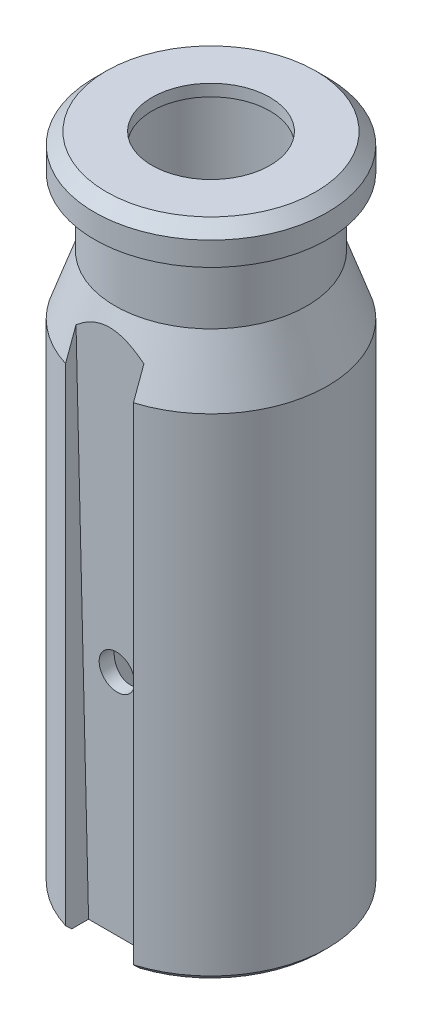
ISO-10303-21;
HEADER;
FILE_DESCRIPTION(('STEP AP214'),'2;1');
FILE_NAME('part.step','',(''),(''),'','','');
FILE_SCHEMA(('AUTOMOTIVE_DESIGN { 1 0 10303 214 1 1 1 1 }'));
ENDSEC;
DATA;
#1=APPLICATION_CONTEXT('core data for automotive mechanical design processes');
#2=APPLICATION_PROTOCOL_DEFINITION('international standard','automotive_design',2000,#1);
#3=PRODUCT_CONTEXT('',#1,'mechanical');
#4=PRODUCT('Part','Part','',(#3));
#5=PRODUCT_RELATED_PRODUCT_CATEGORY('part','',(#4));
#6=PRODUCT_DEFINITION_FORMATION('','',#4);
#7=PRODUCT_DEFINITION_CONTEXT('part definition',#1,'design');
#8=PRODUCT_DEFINITION('design','',#6,#7);
#9=PRODUCT_DEFINITION_SHAPE('','',#8);
#10=(LENGTH_UNIT() NAMED_UNIT(*) SI_UNIT(.MILLI.,.METRE.));
#11=(NAMED_UNIT(*) PLANE_ANGLE_UNIT() SI_UNIT($,.RADIAN.));
#12=(NAMED_UNIT(*) SI_UNIT($,.STERADIAN.) SOLID_ANGLE_UNIT());
#13=UNCERTAINTY_MEASURE_WITH_UNIT(LENGTH_MEASURE(1.E-05),#10,'distance_accuracy_value','');
#14=(GEOMETRIC_REPRESENTATION_CONTEXT(3) GLOBAL_UNCERTAINTY_ASSIGNED_CONTEXT((#13)) GLOBAL_UNIT_ASSIGNED_CONTEXT((#10,
#11,#12)) REPRESENTATION_CONTEXT('',''));
#15=CARTESIAN_POINT('',(0.,0.,0.));
#16=DIRECTION('',(0.,0.,1.));
#17=DIRECTION('',(1.,0.,0.));
#18=AXIS2_PLACEMENT_3D('',#15,#16,#17);
#19=CARTESIAN_POINT('',(1.3,0.,0.));
#20=DIRECTION('',(0.,-1.,0.));
#21=DIRECTION('',(0.,0.,-1.));
#22=AXIS2_PLACEMENT_3D('',#19,#20,#21);
#23=PLANE('',#22);
#24=CARTESIAN_POINT('',(0.,0.,0.));
#25=DIRECTION('',(0.,-1.,0.));
#26=DIRECTION('',(0.,0.,-1.));
#27=AXIS2_PLACEMENT_3D('',#24,#25,#26);
#28=CIRCLE('',#27,1.3);
#29=CARTESIAN_POINT('',(0.,0.,-1.3));
#30=VERTEX_POINT('',#29);
#31=EDGE_CURVE('E253',#30,#30,#28,.T.);
#32=ORIENTED_EDGE('',*,*,#31,.F.);
#33=EDGE_LOOP('',(#32));
#34=FACE_BOUND('',#33,.T.);
#35=CARTESIAN_POINT('',(0.,0.,0.));
#36=DIRECTION('',(0.,-1.,0.));
#37=DIRECTION('',(0.,0.,-1.));
#38=AXIS2_PLACEMENT_3D('',#35,#36,#37);
#39=CIRCLE('',#38,3.75);
#40=CARTESIAN_POINT('',(1.15,0.,-3.56931365951495));
#41=VERTEX_POINT('',#40);
#42=CARTESIAN_POINT('',(1.15,0.,3.56931365951495));
#43=VERTEX_POINT('',#42);
#44=EDGE_CURVE('E147',#41,#43,#39,.T.);
#45=ORIENTED_EDGE('',*,*,#44,.T.);
#46=DIRECTION('',(0.,0.,-1.));
#47=VECTOR('',#46,1.);
#48=CARTESIAN_POINT('',(1.15,0.,3.95));
#49=LINE('',#48,#47);
#50=CARTESIAN_POINT('',(1.15,0.,3.));
#51=VERTEX_POINT('',#50);
#52=EDGE_CURVE('E131',#43,#51,#49,.T.);
#53=ORIENTED_EDGE('',*,*,#52,.T.);
#54=DIRECTION('',(-1.,0.,0.));
#55=VECTOR('',#54,1.);
#56=CARTESIAN_POINT('',(1.15,0.,3.));
#57=LINE('',#56,#55);
#58=CARTESIAN_POINT('',(-1.15,0.,3.));
#59=VERTEX_POINT('',#58);
#60=EDGE_CURVE('E138',#51,#59,#57,.T.);
#61=ORIENTED_EDGE('',*,*,#60,.T.);
#62=DIRECTION('',(0.,0.,1.));
#63=VECTOR('',#62,1.);
#64=CARTESIAN_POINT('',(-1.15,0.,3.95));
#65=LINE('',#64,#63);
#66=CARTESIAN_POINT('',(-1.15,0.,3.56931365951495));
#67=VERTEX_POINT('',#66);
#68=EDGE_CURVE('E142',#59,#67,#65,.T.);
#69=ORIENTED_EDGE('',*,*,#68,.T.);
#70=CARTESIAN_POINT('',(-1.15,0.,-3.56931365951495));
#71=VERTEX_POINT('',#70);
#72=EDGE_CURVE('E157',#67,#71,#39,.T.);
#73=ORIENTED_EDGE('',*,*,#72,.T.);
#74=DIRECTION('',(0.,0.,-1.));
#75=VECTOR('',#74,1.);
#76=CARTESIAN_POINT('',(-1.15,0.,-3.95));
#77=LINE('',#76,#75);
#78=CARTESIAN_POINT('',(-1.15,0.,-3.));
#79=VERTEX_POINT('',#78);
#80=EDGE_CURVE('E171',#79,#71,#77,.T.);
#81=ORIENTED_EDGE('',*,*,#80,.F.);
#82=DIRECTION('',(-1.,0.,0.));
#83=VECTOR('',#82,1.);
#84=CARTESIAN_POINT('',(1.15,0.,-3.));
#85=LINE('',#84,#83);
#86=CARTESIAN_POINT('',(1.15,0.,-3.));
#87=VERTEX_POINT('',#86);
#88=EDGE_CURVE('E175',#87,#79,#85,.T.);
#89=ORIENTED_EDGE('',*,*,#88,.F.);
#90=DIRECTION('',(0.,0.,1.));
#91=VECTOR('',#90,1.);
#92=CARTESIAN_POINT('',(1.15,0.,-3.95));
#93=LINE('',#92,#91);
#94=EDGE_CURVE('E181',#41,#87,#93,.T.);
#95=ORIENTED_EDGE('',*,*,#94,.F.);
#96=EDGE_LOOP('',(#45,#53,#61,#69,#73,#81,#89,#95));
#97=FACE_BOUND('',#96,.T.);
#98=ADVANCED_FACE('F48',(#34,#97),#23,.T.);
#99=CARTESIAN_POINT('',(0.,0.,0.));
#100=DIRECTION('',(0.,1.,0.));
#101=DIRECTION('',(0.,0.,1.));
#102=AXIS2_PLACEMENT_3D('',#99,#100,#101);
#103=CONICAL_SURFACE('',#102,3.75,0.785398163397447);
#104=CARTESIAN_POINT('',(0.,0.2,0.));
#105=DIRECTION('',(0.,-1.,0.));
#106=DIRECTION('',(0.,0.,-1.));
#107=AXIS2_PLACEMENT_3D('',#104,#105,#106);
#108=CIRCLE('',#107,3.95);
#109=CARTESIAN_POINT('',(1.15,0.2,-3.77888872553824));
#110=VERTEX_POINT('',#109);
#111=CARTESIAN_POINT('',(1.15,0.2,3.77888872553824));
#112=VERTEX_POINT('',#111);
#113=EDGE_CURVE('E159',#110,#112,#108,.T.);
#114=ORIENTED_EDGE('',*,*,#113,.T.);
#115=CARTESIAN_POINT('',(1.15,0.200225,3.77912391310804));
#116=CARTESIAN_POINT('',(1.15,0.16675950570913,3.74414562733071));
#117=CARTESIAN_POINT('',(1.15,0.133316342073734,3.70914603116538));
#118=CARTESIAN_POINT('',(1.15,0.0664746754061209,3.63910421731704));
#119=CARTESIAN_POINT('',(1.15,0.0330761723748503,3.60406199963314));
#120=CARTESIAN_POINT('',(1.15,-0.000300000000000059,3.56899847156033));
#121=B_SPLINE_CURVE_WITH_KNOTS('',3,(#115,#116,#117,#118,#119,#120),.UNSPECIFIED.,.F.,.F.,(4,2,
4),(0.,0.14522655518576,0.290453113447055),.UNSPECIFIED.);
#122=EDGE_CURVE('E476',#112,#43,#121,.T.);
#123=ORIENTED_EDGE('',*,*,#122,.T.);
#124=ORIENTED_EDGE('',*,*,#44,.F.);
#125=CARTESIAN_POINT('',(1.15,-0.000200000000000068,-3.56910353450275));
#126=CARTESIAN_POINT('',(1.15,0.0331553961812222,-3.60414514228176));
#127=CARTESIAN_POINT('',(1.15,0.0665330944485576,-3.6391654669155));
#128=CARTESIAN_POINT('',(1.15,0.1333330944495,-3.70916354915272));
#129=CARTESIAN_POINT('',(1.15,0.166755396182165,-3.74414130675709));
#130=CARTESIAN_POINT('',(1.15,0.2002,-3.7790977812171));
#131=B_SPLINE_CURVE_WITH_KNOTS('',3,(#125,#126,#127,#128,#129,#130),.UNSPECIFIED.,.F.,.F.,(4,2,
4),(0.,0.145135953201489,0.290271903335335),.UNSPECIFIED.);
#132=EDGE_CURVE('E251',#41,#110,#131,.T.);
#133=ORIENTED_EDGE('',*,*,#132,.T.);
#134=EDGE_LOOP('',(#114,#123,#124,#133));
#135=FACE_BOUND('',#134,.T.);
#136=ADVANCED_FACE('F224',(#135),#103,.T.);
#137=ORIENTED_EDGE('',*,*,#72,.F.);
#138=CARTESIAN_POINT('',(-1.15,-0.000299999999999731,3.56899847156033));
#139=CARTESIAN_POINT('',(-1.15,0.0330761723748504,3.60406199963314));
#140=CARTESIAN_POINT('',(-1.15,0.0664746754061209,3.63910421731704));
#141=CARTESIAN_POINT('',(-1.15,0.133316342073733,3.70914603116538));
#142=CARTESIAN_POINT('',(-1.15,0.16675950570913,3.74414562733071));
#143=CARTESIAN_POINT('',(-1.15,0.200225,3.77912391310804));
#144=B_SPLINE_CURVE_WITH_KNOTS('',3,(#138,#139,#140,#141,#142,#143),.UNSPECIFIED.,.F.,.F.,(4,2,
4),(0.,0.145226558261294,0.290453113447055),.UNSPECIFIED.);
#145=CARTESIAN_POINT('',(-1.15,0.2,3.77888872553824));
#146=VERTEX_POINT('',#145);
#147=EDGE_CURVE('E149',#67,#146,#144,.T.);
#148=ORIENTED_EDGE('',*,*,#147,.T.);
#149=CARTESIAN_POINT('',(-1.15,0.2,-3.77888872553824));
#150=VERTEX_POINT('',#149);
#151=EDGE_CURVE('E289',#146,#150,#108,.T.);
#152=ORIENTED_EDGE('',*,*,#151,.T.);
#153=CARTESIAN_POINT('',(-1.15,0.2002,-3.7790977812171));
#154=CARTESIAN_POINT('',(-1.15,0.166755396182165,-3.74414130675709));
#155=CARTESIAN_POINT('',(-1.15,0.1333330944495,-3.70916354915272));
#156=CARTESIAN_POINT('',(-1.15,0.0665330944485576,-3.63916546691551));
#157=CARTESIAN_POINT('',(-1.15,0.0331553961812223,-3.60414514228176));
#158=CARTESIAN_POINT('',(-1.15,-0.000199999999999869,-3.56910353450275));
#159=B_SPLINE_CURVE_WITH_KNOTS('',3,(#153,#154,#155,#156,#157,#158),.UNSPECIFIED.,.F.,.F.,(4,2,
4),(0.,0.145135950133845,0.290271903335334),.UNSPECIFIED.);
#160=EDGE_CURVE('E485',#150,#71,#159,.T.);
#161=ORIENTED_EDGE('',*,*,#160,.T.);
#162=EDGE_LOOP('',(#137,#148,#152,#161));
#163=FACE_BOUND('',#162,.T.);
#164=ADVANCED_FACE('F227',(#163),#103,.T.);
#165=CARTESIAN_POINT('',(0.,0.,0.));
#166=DIRECTION('',(0.,-1.,0.));
#167=DIRECTION('',(0.,0.,-1.));
#168=AXIS2_PLACEMENT_3D('',#165,#166,#167);
#169=CYLINDRICAL_SURFACE('',#168,3.95);
#170=CARTESIAN_POINT('',(0.,16.7,0.));
#171=DIRECTION('',(0.,-1.,0.));
#172=DIRECTION('',(0.,0.,-1.));
#173=AXIS2_PLACEMENT_3D('',#170,#171,#172);
#174=CIRCLE('',#173,3.95);
#175=CARTESIAN_POINT('',(1.15,16.7,-3.77888872553824));
#176=VERTEX_POINT('',#175);
#177=CARTESIAN_POINT('',(1.15,16.7,3.77888872553824));
#178=VERTEX_POINT('',#177);
#179=EDGE_CURVE('E286',#176,#178,#174,.T.);
#180=ORIENTED_EDGE('',*,*,#179,.T.);
#181=DIRECTION('',(0.,-1.,0.));
#182=VECTOR('',#181,1.);
#183=CARTESIAN_POINT('',(1.15,0.,3.77888872553824));
#184=LINE('',#183,#182);
#185=EDGE_CURVE('E501',#178,#112,#184,.T.);
#186=ORIENTED_EDGE('',*,*,#185,.T.);
#187=ORIENTED_EDGE('',*,*,#113,.F.);
#188=DIRECTION('',(0.,-1.,0.));
#189=VECTOR('',#188,1.);
#190=CARTESIAN_POINT('',(1.15,0.,-3.77888872553824));
#191=LINE('',#190,#189);
#192=EDGE_CURVE('E483',#110,#176,#191,.F.);
#193=ORIENTED_EDGE('',*,*,#192,.T.);
#194=EDGE_LOOP('',(#180,#186,#187,#193));
#195=FACE_BOUND('',#194,.T.);
#196=ADVANCED_FACE('F229',(#195),#169,.T.);
#197=ORIENTED_EDGE('',*,*,#151,.F.);
#198=DIRECTION('',(0.,-1.,0.));
#199=VECTOR('',#198,1.);
#200=CARTESIAN_POINT('',(-1.15,0.,3.77888872553824));
#201=LINE('',#200,#199);
#202=CARTESIAN_POINT('',(-1.15,16.7,3.77888872553824));
#203=VERTEX_POINT('',#202);
#204=EDGE_CURVE('E148',#146,#203,#201,.F.);
#205=ORIENTED_EDGE('',*,*,#204,.T.);
#206=CARTESIAN_POINT('',(-1.15,16.7,-3.77888872553824));
#207=VERTEX_POINT('',#206);
#208=EDGE_CURVE('E72',#203,#207,#174,.T.);
#209=ORIENTED_EDGE('',*,*,#208,.T.);
#210=DIRECTION('',(0.,-1.,0.));
#211=VECTOR('',#210,1.);
#212=CARTESIAN_POINT('',(-1.15,0.,-3.77888872553824));
#213=LINE('',#212,#211);
#214=EDGE_CURVE('E185',#207,#150,#213,.T.);
#215=ORIENTED_EDGE('',*,*,#214,.T.);
#216=EDGE_LOOP('',(#197,#205,#209,#215));
#217=FACE_BOUND('',#216,.T.);
#218=ADVANCED_FACE('F353',(#217),#169,.T.);
#219=CARTESIAN_POINT('',(0.,16.7,0.));
#220=DIRECTION('',(0.,-1.,0.));
#221=DIRECTION('',(0.,0.,-1.));
#222=AXIS2_PLACEMENT_3D('',#219,#220,#221);
#223=CONICAL_SURFACE('',#222,3.95,0.336674819386727);
#224=CARTESIAN_POINT('',(0.,18.7,0.));
#225=DIRECTION('',(0.,-1.,0.));
#226=DIRECTION('',(0.,0.,-1.));
#227=AXIS2_PLACEMENT_3D('',#224,#225,#226);
#228=CIRCLE('',#227,3.25);
#229=CARTESIAN_POINT('',(0.,18.7,-3.25));
#230=VERTEX_POINT('',#229);
#231=EDGE_CURVE('E283',#230,#230,#228,.T.);
#232=ORIENTED_EDGE('',*,*,#231,.T.);
#233=EDGE_LOOP('',(#232));
#234=FACE_BOUND('',#233,.T.);
#235=CARTESIAN_POINT('',(-1.1503,17.6627331962136,3.42503903413348));
#236=CARTESIAN_POINT('',(-1.11340986937978,17.6942265538726,3.42579689568143));
#237=CARTESIAN_POINT('',(-1.07584878108211,17.7249329414148,3.42653581944581));
#238=CARTESIAN_POINT('',(-0.999194089284043,17.7844779764666,3.42796872135882));
#239=CARTESIAN_POINT('',(-0.960098448803349,17.813313996706,3.42866263628437));
#240=CARTESIAN_POINT('',(-0.838767381594023,17.8975653770501,3.43069007591832));
#241=CARTESIAN_POINT('',(-0.753966097119917,17.9494222485725,3.43193796854854));
#242=CARTESIAN_POINT('',(-0.576330428398146,18.0398971314686,3.43411517161288));
#243=CARTESIAN_POINT('',(-0.483428009821175,18.0783860796479,3.43504137624821));
#244=CARTESIAN_POINT('',(-0.292371766603162,18.1355722067019,3.4364175129955));
#245=CARTESIAN_POINT('',(-0.194277493685058,18.1544573983353,3.43687196947866));
#246=CARTESIAN_POINT('',(-0.0102472295720071,18.1681115244492,3.437200544706));
#247=CARTESIAN_POINT('',(0.0754639963956187,18.1658918347715,3.43714712971375));
#248=CARTESIAN_POINT('',(0.244991873251715,18.1448144305306,3.43663991945127));
#249=CARTESIAN_POINT('',(0.328801908076904,18.1259057137957,3.43618489685605));
#250=CARTESIAN_POINT('',(0.507408868400063,18.0692770282759,3.43482217447723));
#251=CARTESIAN_POINT('',(0.60125689990116,18.028659491094,3.43384474711189));
#252=CARTESIAN_POINT('',(0.78153405653423,17.9334249535095,3.43155300690264));
#253=CARTESIAN_POINT('',(0.867945385931423,17.8787755545299,3.43023791441382));
#254=CARTESIAN_POINT('',(0.985331128168245,17.7947107302308,3.42821496409646));
#255=CARTESIAN_POINT('',(1.01920945671224,17.7691972895163,3.42760100429317));
#256=CARTESIAN_POINT('',(1.08565647121131,17.7168954142107,3.42634240301577));
#257=CARTESIAN_POINT('',(1.11823151905257,17.6901150719987,3.42569795627804));
#258=CARTESIAN_POINT('',(1.1503,17.6627331962136,3.42503903413348));
#259=B_SPLINE_CURVE_WITH_KNOTS('',3,(#235,#236,#237,#238,#239,#240,#241,#242,#243,#244,#245,
#246,#247,#248,#249,#250,#251,#252,#253,#254,#255,#256,#257,#258),.UNSPECIFIED.,.F.,.F.,(4,2,2,
2,2,2,2,2,2,2,2,4),(0.,0.14550977082224,0.291219697585221,0.588520120205237,0.888615916346047,
1.18580623469195,1.44130702487727,1.69759134729063,2.0027028441205,2.30852525816984,
2.4357464331425,2.56224277385796),.UNSPECIFIED.);
#260=CARTESIAN_POINT('',(-1.15,17.6629893599923,3.42504519850249));
#261=VERTEX_POINT('',#260);
#262=CARTESIAN_POINT('',(1.15,17.6629893599923,3.42504519850249));
#263=VERTEX_POINT('',#262);
#264=EDGE_CURVE('E56',#261,#263,#259,.T.);
#265=ORIENTED_EDGE('',*,*,#264,.T.);
#266=CARTESIAN_POINT('',(1.15,18.7002,3.03966198859347));
#267=CARTESIAN_POINT('',(1.15,18.5337505302106,3.10194646119254));
#268=CARTESIAN_POINT('',(1.15,18.3672243723403,3.1640255817215));
#269=CARTESIAN_POINT('',(1.15,18.0340409723636,3.28782941284661));
#270=CARTESIAN_POINT('',(1.15,17.8673837306944,3.3495541246194));
#271=CARTESIAN_POINT('',(1.15,17.5339595001939,3.47270578961336));
#272=CARTESIAN_POINT('',(1.15,17.3671925114622,3.5341327431047));
#273=CARTESIAN_POINT('',(1.15,17.0335635195748,3.65672982321873));
#274=CARTESIAN_POINT('',(1.15,16.866701516106,3.71789994898949));
#275=CARTESIAN_POINT('',(1.15,16.6998,3.77896189513734));
#276=B_SPLINE_CURVE_WITH_KNOTS('',3,(#266,#267,#268,#269,#270,#271,#272,#273,#274,#275),
.UNSPECIFIED.,.F.,.F.,(4,2,2,2,4),(0.,0.533162891940487,1.06632401278206,1.59948464980143,
2.13264705396192),.UNSPECIFIED.);
#277=EDGE_CURVE('E12',#263,#178,#276,.T.);
#278=ORIENTED_EDGE('',*,*,#277,.T.);
#279=ORIENTED_EDGE('',*,*,#179,.F.);
#280=CARTESIAN_POINT('',(1.15,16.6998,-3.77896189513734));
#281=CARTESIAN_POINT('',(1.15,16.866701516106,-3.71789994898949));
#282=CARTESIAN_POINT('',(1.15,17.0335635195748,-3.65672982321873));
#283=CARTESIAN_POINT('',(1.15,17.3671925114622,-3.5341327431047));
#284=CARTESIAN_POINT('',(1.15,17.5339595001939,-3.47270578961337));
#285=CARTESIAN_POINT('',(1.15,17.8673837306944,-3.3495541246194));
#286=CARTESIAN_POINT('',(1.15,18.0340409723636,-3.28782941284661));
#287=CARTESIAN_POINT('',(1.15,18.3672243723403,-3.1640255817215));
#288=CARTESIAN_POINT('',(1.15,18.5337505302106,-3.10194646119254));
#289=CARTESIAN_POINT('',(1.15,18.7002,-3.03966198859348));
#290=B_SPLINE_CURVE_WITH_KNOTS('',3,(#280,#281,#282,#283,#284,#285,#286,#287,#288,#289),
.UNSPECIFIED.,.F.,.F.,(4,2,2,2,4),(0.,0.533162404160496,1.06632304117986,1.59948416202143,
2.13264705396192),.UNSPECIFIED.);
#291=CARTESIAN_POINT('',(1.15,17.6629893599923,-3.42504519850249));
#292=VERTEX_POINT('',#291);
#293=EDGE_CURVE('E195',#176,#292,#290,.T.);
#294=ORIENTED_EDGE('',*,*,#293,.T.);
#295=CARTESIAN_POINT('',(1.1503,17.6627331962136,-3.42503903413348));
#296=CARTESIAN_POINT('',(1.11340986937978,17.6942265538726,-3.42579689568143));
#297=CARTESIAN_POINT('',(1.07584878108211,17.7249329414148,-3.42653581944581));
#298=CARTESIAN_POINT('',(0.999194089284043,17.7844779764666,-3.42796872135882));
#299=CARTESIAN_POINT('',(0.960098448803349,17.813313996706,-3.42866263628437));
#300=CARTESIAN_POINT('',(0.838767381594022,17.8975653770501,-3.43069007591832));
#301=CARTESIAN_POINT('',(0.753966097119915,17.9494222485725,-3.43193796854854));
#302=CARTESIAN_POINT('',(0.576330428398144,18.0398971314686,-3.43411517161288));
#303=CARTESIAN_POINT('',(0.483428009821173,18.0783860796479,-3.43504137624821));
#304=CARTESIAN_POINT('',(0.292371766603159,18.1355722067019,-3.4364175129955));
#305=CARTESIAN_POINT('',(0.194277493685054,18.1544573983353,-3.43687196947866));
#306=CARTESIAN_POINT('',(0.0102472295720029,18.1681115244492,-3.437200544706));
#307=CARTESIAN_POINT('',(-0.0754639963956222,18.1658918347715,-3.43714712971375));
#308=CARTESIAN_POINT('',(-0.244991873251718,18.1448144305306,-3.43663991945127));
#309=CARTESIAN_POINT('',(-0.328801908076907,18.1259057137957,-3.43618489685605));
#310=CARTESIAN_POINT('',(-0.507408868400066,18.0692770282759,-3.43482217447723));
#311=CARTESIAN_POINT('',(-0.601256899901163,18.028659491094,-3.43384474711189));
#312=CARTESIAN_POINT('',(-0.781534056534232,17.9334249535095,-3.43155300690264));
#313=CARTESIAN_POINT('',(-0.867945385931425,17.8787755545299,-3.43023791441382));
#314=CARTESIAN_POINT('',(-0.985331128168246,17.7947107302308,-3.42821496409646));
#315=CARTESIAN_POINT('',(-1.01920945671224,17.7691972895163,-3.42760100429317));
#316=CARTESIAN_POINT('',(-1.08565647121131,17.7168954142107,-3.42634240301577));
#317=CARTESIAN_POINT('',(-1.11823151905257,17.6901150719987,-3.42569795627804));
#318=CARTESIAN_POINT('',(-1.1503,17.6627331962136,-3.42503903413348));
#319=B_SPLINE_CURVE_WITH_KNOTS('',3,(#295,#296,#297,#298,#299,#300,#301,#302,#303,#304,#305,
#306,#307,#308,#309,#310,#311,#312,#313,#314,#315,#316,#317,#318),.UNSPECIFIED.,.F.,.F.,(4,2,2,
2,2,2,2,2,2,2,2,4),(0.,0.145509770822242,0.291219697585223,0.58852012020524,0.888615916346052,
1.18580623469195,1.44130702487728,1.69759134729064,2.0027028441205,2.30852525816984,
2.43574643314251,2.56224277385796),.UNSPECIFIED.);
#320=CARTESIAN_POINT('',(-1.15,17.6629893599923,-3.42504519850249));
#321=VERTEX_POINT('',#320);
#322=EDGE_CURVE('E299',#292,#321,#319,.T.);
#323=ORIENTED_EDGE('',*,*,#322,.T.);
#324=CARTESIAN_POINT('',(-1.15,18.7002,-3.03966198859347));
#325=CARTESIAN_POINT('',(-1.15,18.5337505302106,-3.10194646119254));
#326=CARTESIAN_POINT('',(-1.15,18.3672243723403,-3.1640255817215));
#327=CARTESIAN_POINT('',(-1.15,18.0340409723636,-3.28782941284661));
#328=CARTESIAN_POINT('',(-1.15,17.8673837306944,-3.3495541246194));
#329=CARTESIAN_POINT('',(-1.15,17.5339595001939,-3.47270578961336));
#330=CARTESIAN_POINT('',(-1.15,17.3671925114622,-3.5341327431047));
#331=CARTESIAN_POINT('',(-1.15,17.0335635195748,-3.65672982321872));
#332=CARTESIAN_POINT('',(-1.15,16.866701516106,-3.71789994898949));
#333=CARTESIAN_POINT('',(-1.15,16.6998,-3.77896189513734));
#334=B_SPLINE_CURVE_WITH_KNOTS('',3,(#324,#325,#326,#327,#328,#329,#330,#331,#332,#333),
.UNSPECIFIED.,.F.,.F.,(4,2,2,2,4),(0.,0.533162891940483,1.06632401278206,1.59948464980142,
2.13264705396192),.UNSPECIFIED.);
#335=EDGE_CURVE('E292',#321,#207,#334,.T.);
#336=ORIENTED_EDGE('',*,*,#335,.T.);
#337=ORIENTED_EDGE('',*,*,#208,.F.);
#338=CARTESIAN_POINT('',(-1.15,16.6998,3.77896189513734));
#339=CARTESIAN_POINT('',(-1.15,16.866701516106,3.71789994898949));
#340=CARTESIAN_POINT('',(-1.15,17.0335635195748,3.65672982321873));
#341=CARTESIAN_POINT('',(-1.15,17.3671925114622,3.5341327431047));
#342=CARTESIAN_POINT('',(-1.15,17.5339595001939,3.47270578961337));
#343=CARTESIAN_POINT('',(-1.15,17.8673837306944,3.3495541246194));
#344=CARTESIAN_POINT('',(-1.15,18.0340409723636,3.28782941284661));
#345=CARTESIAN_POINT('',(-1.15,18.3672243723403,3.1640255817215));
#346=CARTESIAN_POINT('',(-1.15,18.5337505302106,3.10194646119255));
#347=CARTESIAN_POINT('',(-1.15,18.7002,3.03966198859348));
#348=B_SPLINE_CURVE_WITH_KNOTS('',3,(#338,#339,#340,#341,#342,#343,#344,#345,#346,#347),
.UNSPECIFIED.,.F.,.F.,(4,2,2,2,4),(0.,0.533162404160496,1.06632304117986,1.59948416202143,
2.13264705396192),.UNSPECIFIED.);
#349=EDGE_CURVE('E188',#203,#261,#348,.T.);
#350=ORIENTED_EDGE('',*,*,#349,.T.);
#351=EDGE_LOOP('',(#265,#278,#279,#294,#323,#336,#337,#350));
#352=FACE_BOUND('',#351,.T.);
#353=ADVANCED_FACE('F201',(#234,#352),#223,.T.);
#354=CARTESIAN_POINT('',(0.,0.,0.));
#355=DIRECTION('',(0.,-1.,0.));
#356=DIRECTION('',(0.,0.,-1.));
#357=AXIS2_PLACEMENT_3D('',#354,#355,#356);
#358=CYLINDRICAL_SURFACE('',#357,3.25);
#359=CARTESIAN_POINT('',(0.,21.,0.));
#360=DIRECTION('',(0.,-1.,0.));
#361=DIRECTION('',(0.,0.,-1.));
#362=AXIS2_PLACEMENT_3D('',#359,#360,#361);
#363=CIRCLE('',#362,3.25);
#364=CARTESIAN_POINT('',(0.,21.,-3.25));
#365=VERTEX_POINT('',#364);
#366=EDGE_CURVE('E280',#365,#365,#363,.T.);
#367=ORIENTED_EDGE('',*,*,#366,.T.);
#368=EDGE_LOOP('',(#367));
#369=FACE_BOUND('',#368,.T.);
#370=ORIENTED_EDGE('',*,*,#231,.F.);
#371=EDGE_LOOP('',(#370));
#372=FACE_BOUND('',#371,.T.);
#373=ADVANCED_FACE('F346',(#369,#372),#358,.T.);
#374=CARTESIAN_POINT('',(3.25,21.,0.));
#375=DIRECTION('',(0.,-1.,0.));
#376=DIRECTION('',(0.,0.,-1.));
#377=AXIS2_PLACEMENT_3D('',#374,#375,#376);
#378=PLANE('',#377);
#379=CARTESIAN_POINT('',(0.,21.,0.));
#380=DIRECTION('',(0.,-1.,0.));
#381=DIRECTION('',(0.,0.,-1.));
#382=AXIS2_PLACEMENT_3D('',#379,#380,#381);
#383=CIRCLE('',#382,3.95);
#384=CARTESIAN_POINT('',(0.,21.,-3.95));
#385=VERTEX_POINT('',#384);
#386=EDGE_CURVE('E277',#385,#385,#383,.T.);
#387=ORIENTED_EDGE('',*,*,#386,.T.);
#388=EDGE_LOOP('',(#387));
#389=FACE_BOUND('',#388,.T.);
#390=ORIENTED_EDGE('',*,*,#366,.F.);
#391=EDGE_LOOP('',(#390));
#392=FACE_BOUND('',#391,.T.);
#393=ADVANCED_FACE('F343',(#389,#392),#378,.T.);
#394=CARTESIAN_POINT('',(0.,0.,0.));
#395=DIRECTION('',(0.,-1.,0.));
#396=DIRECTION('',(0.,0.,-1.));
#397=AXIS2_PLACEMENT_3D('',#394,#395,#396);
#398=CYLINDRICAL_SURFACE('',#397,3.95);
#399=CARTESIAN_POINT('',(0.,21.8,0.));
#400=DIRECTION('',(0.,-1.,0.));
#401=DIRECTION('',(0.,0.,-1.));
#402=AXIS2_PLACEMENT_3D('',#399,#400,#401);
#403=CIRCLE('',#402,3.95);
#404=CARTESIAN_POINT('',(0.,21.8,-3.95));
#405=VERTEX_POINT('',#404);
#406=EDGE_CURVE('E274',#405,#405,#403,.T.);
#407=ORIENTED_EDGE('',*,*,#406,.T.);
#408=EDGE_LOOP('',(#407));
#409=FACE_BOUND('',#408,.T.);
#410=ORIENTED_EDGE('',*,*,#386,.F.);
#411=EDGE_LOOP('',(#410));
#412=FACE_BOUND('',#411,.T.);
#413=ADVANCED_FACE('F339',(#409,#412),#398,.T.);
#414=CARTESIAN_POINT('',(0.,21.8,0.));
#415=DIRECTION('',(0.,-1.,0.));
#416=DIRECTION('',(0.,0.,-1.));
#417=AXIS2_PLACEMENT_3D('',#414,#415,#416);
#418=CONICAL_SURFACE('',#417,3.95,0.785398163397447);
#419=CARTESIAN_POINT('',(0.,22.2,0.));
#420=DIRECTION('',(0.,-1.,0.));
#421=DIRECTION('',(0.,0.,-1.));
#422=AXIS2_PLACEMENT_3D('',#419,#420,#421);
#423=CIRCLE('',#422,3.55);
#424=CARTESIAN_POINT('',(0.,22.2,-3.55));
#425=VERTEX_POINT('',#424);
#426=EDGE_CURVE('E271',#425,#425,#423,.T.);
#427=ORIENTED_EDGE('',*,*,#426,.T.);
#428=EDGE_LOOP('',(#427));
#429=FACE_BOUND('',#428,.T.);
#430=ORIENTED_EDGE('',*,*,#406,.F.);
#431=EDGE_LOOP('',(#430));
#432=FACE_BOUND('',#431,.T.);
#433=ADVANCED_FACE('F335',(#429,#432),#418,.T.);
#434=CARTESIAN_POINT('',(3.55,22.2,0.));
#435=DIRECTION('',(0.,1.,0.));
#436=DIRECTION('',(0.,0.,1.));
#437=AXIS2_PLACEMENT_3D('',#434,#435,#436);
#438=PLANE('',#437);
#439=CARTESIAN_POINT('',(0.,22.2,0.));
#440=DIRECTION('',(0.,-1.,0.));
#441=DIRECTION('',(0.,0.,-1.));
#442=AXIS2_PLACEMENT_3D('',#439,#440,#441);
#443=CIRCLE('',#442,2.00000000000001);
#444=CARTESIAN_POINT('',(0.,22.2,-2.00000000000001));
#445=VERTEX_POINT('',#444);
#446=EDGE_CURVE('E268',#445,#445,#443,.T.);
#447=ORIENTED_EDGE('',*,*,#446,.T.);
#448=EDGE_LOOP('',(#447));
#449=FACE_BOUND('',#448,.T.);
#450=ORIENTED_EDGE('',*,*,#426,.F.);
#451=EDGE_LOOP('',(#450));
#452=FACE_BOUND('',#451,.T.);
#453=ADVANCED_FACE('F331',(#449,#452),#438,.T.);
#454=CARTESIAN_POINT('',(0.,0.,0.));
#455=DIRECTION('',(0.,-1.,0.));
#456=DIRECTION('',(0.,0.,-1.));
#457=AXIS2_PLACEMENT_3D('',#454,#455,#456);
#458=CYLINDRICAL_SURFACE('',#457,2.00000000000001);
#459=CARTESIAN_POINT('',(0.,21.8,0.));
#460=DIRECTION('',(0.,-1.,0.));
#461=DIRECTION('',(0.,0.,-1.));
#462=AXIS2_PLACEMENT_3D('',#459,#460,#461);
#463=CIRCLE('',#462,2.00000000000001);
#464=CARTESIAN_POINT('',(0.,21.8,-2.00000000000001));
#465=VERTEX_POINT('',#464);
#466=EDGE_CURVE('E265',#465,#465,#463,.T.);
#467=ORIENTED_EDGE('',*,*,#466,.T.);
#468=EDGE_LOOP('',(#467));
#469=FACE_BOUND('',#468,.T.);
#470=ORIENTED_EDGE('',*,*,#446,.F.);
#471=EDGE_LOOP('',(#470));
#472=FACE_BOUND('',#471,.T.);
#473=ADVANCED_FACE('F327',(#469,#472),#458,.F.);
#474=CARTESIAN_POINT('',(2.00000000000001,21.8,0.));
#475=DIRECTION('',(0.,-1.,0.));
#476=DIRECTION('',(0.,0.,-1.));
#477=AXIS2_PLACEMENT_3D('',#474,#475,#476);
#478=PLANE('',#477);
#479=CARTESIAN_POINT('',(0.,21.8,0.));
#480=DIRECTION('',(0.,-1.,0.));
#481=DIRECTION('',(0.,0.,-1.));
#482=AXIS2_PLACEMENT_3D('',#479,#480,#481);
#483=CIRCLE('',#482,2.75000000000001);
#484=CARTESIAN_POINT('',(0.,21.8,-2.75000000000001));
#485=VERTEX_POINT('',#484);
#486=EDGE_CURVE('E262',#485,#485,#483,.T.);
#487=ORIENTED_EDGE('',*,*,#486,.T.);
#488=EDGE_LOOP('',(#487));
#489=FACE_BOUND('',#488,.T.);
#490=ORIENTED_EDGE('',*,*,#466,.F.);
#491=EDGE_LOOP('',(#490));
#492=FACE_BOUND('',#491,.T.);
#493=ADVANCED_FACE('F323',(#489,#492),#478,.T.);
#494=CARTESIAN_POINT('',(0.,0.,0.));
#495=DIRECTION('',(0.,-1.,0.));
#496=DIRECTION('',(0.,0.,-1.));
#497=AXIS2_PLACEMENT_3D('',#494,#495,#496);
#498=CYLINDRICAL_SURFACE('',#497,2.75000000000001);
#499=CARTESIAN_POINT('',(0.,7.33596583134108,2.75000000000001));
#500=CARTESIAN_POINT('',(0.0331659214326952,7.33596699578586,2.74999938913567));
#501=CARTESIAN_POINT('',(0.0663456058881966,7.33874069463018,2.74939388629404));
#502=CARTESIAN_POINT('',(0.131759530532624,7.34974693079521,2.74703717017002));
#503=CARTESIAN_POINT('',(0.163993071542689,7.35798340395398,2.7452851308393));
#504=CARTESIAN_POINT('',(0.226556699836022,7.37963353578691,2.74083106153913));
#505=CARTESIAN_POINT('',(0.256888988161396,7.39304107434399,2.73813015491918));
#506=CARTESIAN_POINT('',(0.314881423767141,7.42462429093625,2.73206898186275));
#507=CARTESIAN_POINT('',(0.342541607435513,7.44279990402856,2.72870872440702));
#508=CARTESIAN_POINT('',(0.394934724379752,7.48375941285474,2.7216241914402));
#509=CARTESIAN_POINT('',(0.419609415411235,7.50661689648398,2.71789466748437));
#510=CARTESIAN_POINT('',(0.464829691393052,7.55612118709563,2.71052752197805));
#511=CARTESIAN_POINT('',(0.485374788627002,7.58276844102647,2.70688991132707));
#512=CARTESIAN_POINT('',(0.522071334829777,7.63960060596122,2.70005492219873));
#513=CARTESIAN_POINT('',(0.53814770760675,7.66983504137468,2.69686546559033));
#514=CARTESIAN_POINT('',(0.564981037349098,7.73265473475451,2.69137237003753));
#515=CARTESIAN_POINT('',(0.575738545462899,7.76523974874939,2.68906863931844));
#516=CARTESIAN_POINT('',(0.5914682398766,7.83135437276796,2.68565259199219));
#517=CARTESIAN_POINT('',(0.596519615386489,7.86486426901519,2.68452398482042));
#518=CARTESIAN_POINT('',(0.600923530968317,7.93227326580655,2.68354176699104));
#519=CARTESIAN_POINT('',(0.600276914108151,7.96617230803189,2.68368796771441));
#520=CARTESIAN_POINT('',(0.593370128271301,8.03261474480009,2.68522316717104));
#521=CARTESIAN_POINT('',(0.58723243813251,8.06517158665916,2.68658504857318));
#522=CARTESIAN_POINT('',(0.569697647911581,8.12877168282488,2.69035764949983));
#523=CARTESIAN_POINT('',(0.558300395597492,8.15981489329246,2.69276839938252));
#524=CARTESIAN_POINT('',(0.530543545687235,8.21962928201133,2.69837423152007));
#525=CARTESIAN_POINT('',(0.514169413331348,8.24839349010891,2.70157160579332));
#526=CARTESIAN_POINT('',(0.476932075113571,8.30279653466839,2.70839307430804));
#527=CARTESIAN_POINT('',(0.456068325077486,8.32843499167596,2.71201722025319));
#528=CARTESIAN_POINT('',(0.409954186175092,8.37640123295886,2.71937350145316));
#529=CARTESIAN_POINT('',(0.3846247636183,8.39865297953102,2.72310635047855));
#530=CARTESIAN_POINT('',(0.330561152019509,8.43862055163096,2.73019623660498));
#531=CARTESIAN_POINT('',(0.301826851565273,8.45633622867238,2.73355326140156));
#532=CARTESIAN_POINT('',(0.241580623476384,8.48681059032789,2.73953620687157));
#533=CARTESIAN_POINT('',(0.210055315392808,8.49954361220255,2.74215832332228));
#534=CARTESIAN_POINT('',(0.145248745668964,8.51953700935685,2.74635322578008));
#535=CARTESIAN_POINT('',(0.111967681874761,8.52679799984495,2.74792612974553));
#536=CARTESIAN_POINT('',(0.0451379243216196,8.53555090282971,2.74982960280356));
#537=CARTESIAN_POINT('',(0.0116010548274332,8.53712911802085,2.75017875447943));
#538=CARTESIAN_POINT('',(-0.0552593011442838,8.53470683778165,2.74964796620387));
#539=CARTESIAN_POINT('',(-0.0885827994143573,8.53070665337748,2.74876809477717));
#540=CARTESIAN_POINT('',(-0.153755156429979,8.51731664959835,2.7458904378985));
#541=CARTESIAN_POINT('',(-0.185614755583385,8.50797671682825,2.74390300412756));
#542=CARTESIAN_POINT('',(-0.247309030666511,8.48422286686041,2.73903206712824));
#543=CARTESIAN_POINT('',(-0.277143552273508,8.46980856348267,2.73614849570215));
#544=CARTESIAN_POINT('',(-0.33432770848059,8.43611257736701,2.72975518369503));
#545=CARTESIAN_POINT('',(-0.361644018784109,8.41677568184482,2.72623848236448));
#546=CARTESIAN_POINT('',(-0.412665542952714,8.37384467740273,2.7189837080645));
#547=CARTESIAN_POINT('',(-0.436370384028618,8.35025012954061,2.71524561229715));
#548=CARTESIAN_POINT('',(-0.479830546224975,8.29907100141773,2.70790623688848));
#549=CARTESIAN_POINT('',(-0.499526731409327,8.27143576635172,2.70430756335646));
#550=CARTESIAN_POINT('',(-0.533984262599396,8.2131767313112,2.69771567115481));
#551=CARTESIAN_POINT('',(-0.548745935052892,8.18255312920843,2.69472241243852));
#552=CARTESIAN_POINT('',(-0.572787027348499,8.11943704146855,2.68971477334224));
#553=CARTESIAN_POINT('',(-0.582110502084632,8.08696198189943,2.6876925509257));
#554=CARTESIAN_POINT('',(-0.595169117521035,8.02085828979291,2.68483131604561));
#555=CARTESIAN_POINT('',(-0.598905056899758,7.98722982282584,2.68399213448));
#556=CARTESIAN_POINT('',(-0.600662252487389,7.92047358987892,2.68359934392617));
#557=CARTESIAN_POINT('',(-0.598793134074382,7.88734879078932,2.68402107318849));
#558=CARTESIAN_POINT('',(-0.589653341936792,7.82189161719763,2.68604363558474));
#559=CARTESIAN_POINT('',(-0.582382581246216,7.78955925546238,2.68764448770245));
#560=CARTESIAN_POINT('',(-0.562663449421889,7.72653184172611,2.69184150866654));
#561=CARTESIAN_POINT('',(-0.550207191918937,7.69583936431469,2.69443919307389));
#562=CARTESIAN_POINT('',(-0.520486299463961,7.63695199944261,2.70033748889517));
#563=CARTESIAN_POINT('',(-0.503221071461974,7.60875742059243,2.70363818699406));
#564=CARTESIAN_POINT('',(-0.463900810381157,7.55497280723304,2.71066466966109));
#565=CARTESIAN_POINT('',(-0.441744505682851,7.52945782610721,2.71439850151395));
#566=CARTESIAN_POINT('',(-0.393473859686591,7.48247444285014,2.72181436054254));
#567=CARTESIAN_POINT('',(-0.367358611983683,7.4610069699329,2.72549637564323));
#568=CARTESIAN_POINT('',(-0.311547815385953,7.42250997502106,2.73244152633115));
#569=CARTESIAN_POINT('',(-0.281815474978944,7.40553279847281,2.73569951394516));
#570=CARTESIAN_POINT('',(-0.219843861373389,7.37687324744432,2.74137433232467));
#571=CARTESIAN_POINT('',(-0.187606840840383,7.3651861782655,2.74379190846829));
#572=CARTESIAN_POINT('',(-0.129438338875106,7.34958942102422,2.7470680319333));
#573=CARTESIAN_POINT('',(-0.103832293363478,7.34449068910323,2.74816069237013));
#574=CARTESIAN_POINT('',(-0.0521536524512231,7.33767852567912,2.74962689762756));
#575=CARTESIAN_POINT('',(-0.0260810817285898,7.33596491564273,2.7500004803727));
#576=CARTESIAN_POINT('',(0.,7.33596583134108,2.75000000000001));
#577=B_SPLINE_CURVE_WITH_KNOTS('',3,(#499,#500,#501,#502,#503,#504,#505,#506,#507,#508,#509,
#510,#511,#512,#513,#514,#515,#516,#517,#518,#519,#520,#521,#522,#523,#524,#525,#526,#527,#528,
#529,#530,#531,#532,#533,#534,#535,#536,#537,#538,#539,#540,#541,#542,#543,#544,#545,#546,#547,
#548,#549,#550,#551,#552,#553,#554,#555,#556,#557,#558,#559,#560,#561,#562,#563,#564,#565,#566,
#567,#568,#569,#570,#571,#572,#573,#574,#575,#576),.UNSPECIFIED.,.T.,.F.,(4,2,2,2,2,2,2,2,2,2,2,
2,2,2,2,2,2,2,2,2,2,2,2,2,2,2,2,2,2,2,2,2,2,2,2,2,2,2,4),(0.,0.0994019643308978,
0.198875624035762,0.298231913058714,0.397586848883734,0.498643271329209,0.599711621812399,
0.702387423218752,0.805052582979554,0.90627475428671,1.00748194913828,1.10648648485333,
1.20549388632004,1.30479325901255,1.40410467429475,1.50539243788491,1.60668351666419,
1.70848962813796,1.81028429206602,1.91052635086101,2.01076282083882,2.11007778704159,
2.2094003131467,2.30989012351191,2.41039029978842,2.51227995869269,2.61416287564688,
2.71520854446923,2.81623976851249,2.91530796504716,3.01437775660614,3.11359877222943,
3.2128320293693,3.31435359881409,3.41589844695179,3.51857951385573,3.62116927706647,
3.69934130983576,3.77750921965722),.UNSPECIFIED.);
#578=CARTESIAN_POINT('',(0.,7.33596583134108,2.75000000000001));
#579=VERTEX_POINT('',#578);
#580=EDGE_CURVE('E455',#579,#579,#577,.T.);
#581=ORIENTED_EDGE('',*,*,#580,.T.);
#582=EDGE_LOOP('',(#581));
#583=FACE_BOUND('',#582,.T.);
#584=CARTESIAN_POINT('',(0.,4.,0.));
#585=DIRECTION('',(0.,-1.,0.));
#586=DIRECTION('',(0.,0.,-1.));
#587=AXIS2_PLACEMENT_3D('',#584,#585,#586);
#588=CIRCLE('',#587,2.75000000000002);
#589=CARTESIAN_POINT('',(0.,4.,-2.75000000000002));
#590=VERTEX_POINT('',#589);
#591=EDGE_CURVE('E259',#590,#590,#588,.T.);
#592=ORIENTED_EDGE('',*,*,#591,.T.);
#593=EDGE_LOOP('',(#592));
#594=FACE_BOUND('',#593,.T.);
#595=ORIENTED_EDGE('',*,*,#486,.F.);
#596=EDGE_LOOP('',(#595));
#597=FACE_BOUND('',#596,.T.);
#598=ADVANCED_FACE('F319',(#583,#594,#597),#498,.F.);
#599=CARTESIAN_POINT('',(1.3,4.,0.));
#600=DIRECTION('',(0.,1.,0.));
#601=DIRECTION('',(0.,0.,1.));
#602=AXIS2_PLACEMENT_3D('',#599,#600,#601);
#603=PLANE('',#602);
#604=CARTESIAN_POINT('',(0.,4.,0.));
#605=DIRECTION('',(0.,-1.,0.));
#606=DIRECTION('',(0.,0.,-1.));
#607=AXIS2_PLACEMENT_3D('',#604,#605,#606);
#608=CIRCLE('',#607,1.3);
#609=CARTESIAN_POINT('',(0.,4.,-1.3));
#610=VERTEX_POINT('',#609);
#611=EDGE_CURVE('E256',#610,#610,#608,.T.);
#612=ORIENTED_EDGE('',*,*,#611,.T.);
#613=EDGE_LOOP('',(#612));
#614=FACE_BOUND('',#613,.T.);
#615=ORIENTED_EDGE('',*,*,#591,.F.);
#616=EDGE_LOOP('',(#615));
#617=FACE_BOUND('',#616,.T.);
#618=ADVANCED_FACE('F315',(#614,#617),#603,.T.);
#619=CARTESIAN_POINT('',(0.,0.,0.));
#620=DIRECTION('',(0.,-1.,0.));
#621=DIRECTION('',(0.,0.,-1.));
#622=AXIS2_PLACEMENT_3D('',#619,#620,#621);
#623=CYLINDRICAL_SURFACE('',#622,1.3);
#624=ORIENTED_EDGE('',*,*,#31,.T.);
#625=EDGE_LOOP('',(#624));
#626=FACE_BOUND('',#625,.T.);
#627=ORIENTED_EDGE('',*,*,#611,.F.);
#628=EDGE_LOOP('',(#627));
#629=FACE_BOUND('',#628,.T.);
#630=ADVANCED_FACE('F311',(#626,#629),#623,.F.);
#631=CARTESIAN_POINT('',(1.15,0.,0.));
#632=DIRECTION('',(-1.,0.,0.));
#633=DIRECTION('',(0.,0.,1.));
#634=AXIS2_PLACEMENT_3D('',#631,#632,#633);
#635=PLANE('',#634);
#636=ORIENTED_EDGE('',*,*,#94,.T.);
#637=DIRECTION('',(0.,-0.999710583525427,0.0240572065554248));
#638=VECTOR('',#637,1.);
#639=CARTESIAN_POINT('',(1.15,18.7,-3.45));
#640=LINE('',#639,#638);
#641=EDGE_CURVE('E481',#292,#87,#640,.T.);
#642=ORIENTED_EDGE('',*,*,#641,.F.);
#643=ORIENTED_EDGE('',*,*,#293,.F.);
#644=ORIENTED_EDGE('',*,*,#192,.F.);
#645=ORIENTED_EDGE('',*,*,#132,.F.);
#646=EDGE_LOOP('',(#636,#642,#643,#644,#645));
#647=FACE_BOUND('',#646,.T.);
#648=ADVANCED_FACE('F211',(#647),#635,.T.);
#649=CARTESIAN_POINT('',(0.,-0.0721507320105462,-2.99826375243825));
#650=DIRECTION('',(0.,-0.0240572065554248,-0.999710583525427));
#651=DIRECTION('',(0.,0.999710583525427,-0.0240572065554248));
#652=AXIS2_PLACEMENT_3D('',#649,#650,#651);
#653=PLANE('',#652);
#654=ORIENTED_EDGE('',*,*,#641,.T.);
#655=ORIENTED_EDGE('',*,*,#88,.T.);
#656=DIRECTION('',(0.,-0.999710583525427,0.0240572065554248));
#657=VECTOR('',#656,1.);
#658=CARTESIAN_POINT('',(-1.15,18.7,-3.45));
#659=LINE('',#658,#657);
#660=EDGE_CURVE('E176',#321,#79,#659,.T.);
#661=ORIENTED_EDGE('',*,*,#660,.F.);
#662=ORIENTED_EDGE('',*,*,#322,.F.);
#663=EDGE_LOOP('',(#654,#655,#661,#662));
#664=FACE_BOUND('',#663,.T.);
#665=ADVANCED_FACE('F308',(#664),#653,.T.);
#666=CARTESIAN_POINT('',(-1.15,0.,0.));
#667=DIRECTION('',(1.,0.,0.));
#668=DIRECTION('',(0.,0.,-1.));
#669=AXIS2_PLACEMENT_3D('',#666,#667,#668);
#670=PLANE('',#669);
#671=ORIENTED_EDGE('',*,*,#214,.F.);
#672=ORIENTED_EDGE('',*,*,#335,.F.);
#673=ORIENTED_EDGE('',*,*,#660,.T.);
#674=ORIENTED_EDGE('',*,*,#80,.T.);
#675=ORIENTED_EDGE('',*,*,#160,.F.);
#676=EDGE_LOOP('',(#671,#672,#673,#674,#675));
#677=FACE_BOUND('',#676,.T.);
#678=ADVANCED_FACE('F304',(#677),#670,.T.);
#679=CARTESIAN_POINT('',(1.15,0.,0.));
#680=DIRECTION('',(-1.,0.,0.));
#681=DIRECTION('',(0.,0.,-1.));
#682=AXIS2_PLACEMENT_3D('',#679,#680,#681);
#683=PLANE('',#682);
#684=ORIENTED_EDGE('',*,*,#185,.F.);
#685=ORIENTED_EDGE('',*,*,#277,.F.);
#686=DIRECTION('',(0.,-0.999710583525427,-0.0240572065554248));
#687=VECTOR('',#686,1.);
#688=CARTESIAN_POINT('',(1.15,18.7,3.45));
#689=LINE('',#688,#687);
#690=EDGE_CURVE('E127',#263,#51,#689,.T.);
#691=ORIENTED_EDGE('',*,*,#690,.T.);
#692=ORIENTED_EDGE('',*,*,#52,.F.);
#693=ORIENTED_EDGE('',*,*,#122,.F.);
#694=EDGE_LOOP('',(#684,#685,#691,#692,#693));
#695=FACE_BOUND('',#694,.T.);
#696=ADVANCED_FACE('F129',(#695),#683,.T.);
#697=CARTESIAN_POINT('',(0.,-0.0721507320105462,2.99826375243825));
#698=DIRECTION('',(0.,-0.0240572065554248,0.999710583525427));
#699=DIRECTION('',(0.,0.999710583525427,0.0240572065554248));
#700=AXIS2_PLACEMENT_3D('',#697,#698,#699);
#701=PLANE('',#700);
#702=CARTESIAN_POINT('',(0.,7.92553393619287,3.19072140488165));
#703=DIRECTION('',(0.,-0.0240572065554248,0.999710583525427));
#704=DIRECTION('',(0.,-0.999710583525427,-0.0240572065554248));
#705=AXIS2_PLACEMENT_3D('',#702,#703,#704);
#706=CIRCLE('',#705,0.6);
#707=CARTESIAN_POINT('',(0.,7.32570758607761,3.17628708094839));
#708=VERTEX_POINT('',#707);
#709=EDGE_CURVE('E135',#708,#708,#706,.T.);
#710=ORIENTED_EDGE('',*,*,#709,.F.);
#711=EDGE_LOOP('',(#710));
#712=FACE_BOUND('',#711,.T.);
#713=DIRECTION('',(0.,-0.999710583525427,-0.0240572065554248));
#714=VECTOR('',#713,1.);
#715=CARTESIAN_POINT('',(-1.15,18.7,3.45));
#716=LINE('',#715,#714);
#717=EDGE_CURVE('E64',#261,#59,#716,.T.);
#718=ORIENTED_EDGE('',*,*,#717,.T.);
#719=ORIENTED_EDGE('',*,*,#60,.F.);
#720=ORIENTED_EDGE('',*,*,#690,.F.);
#721=ORIENTED_EDGE('',*,*,#264,.F.);
#722=EDGE_LOOP('',(#718,#719,#720,#721));
#723=FACE_BOUND('',#722,.T.);
#724=ADVANCED_FACE('F139',(#712,#723),#701,.T.);
#725=CARTESIAN_POINT('',(-1.15,0.,0.));
#726=DIRECTION('',(1.,0.,0.));
#727=DIRECTION('',(0.,0.,1.));
#728=AXIS2_PLACEMENT_3D('',#725,#726,#727);
#729=PLANE('',#728);
#730=ORIENTED_EDGE('',*,*,#68,.F.);
#731=ORIENTED_EDGE('',*,*,#717,.F.);
#732=ORIENTED_EDGE('',*,*,#349,.F.);
#733=ORIENTED_EDGE('',*,*,#204,.F.);
#734=ORIENTED_EDGE('',*,*,#147,.F.);
#735=EDGE_LOOP('',(#730,#731,#732,#733,#734));
#736=FACE_BOUND('',#735,.T.);
#737=ADVANCED_FACE('F205',(#736),#729,.T.);
#738=CARTESIAN_POINT('',(0.,8.10555599296745,-4.29019517663982));
#739=DIRECTION('',(0.,-0.0240572065554248,0.999710583525427));
#740=DIRECTION('',(0.,-0.999710583525427,-0.0240572065554248));
#741=AXIS2_PLACEMENT_3D('',#738,#739,#740);
#742=CYLINDRICAL_SURFACE('',#741,0.6);
#743=ORIENTED_EDGE('',*,*,#580,.F.);
#744=EDGE_LOOP('',(#743));
#745=FACE_BOUND('',#744,.T.);
#746=ORIENTED_EDGE('',*,*,#709,.T.);
#747=EDGE_LOOP('',(#746));
#748=FACE_BOUND('',#747,.T.);
#749=ADVANCED_FACE('F209',(#745,#748),#742,.F.);
#750=CLOSED_SHELL('',(#98,#136,#164,#196,#218,#353,#373,#393,#413,#433,#453,#473,#493,#598,#618,
#630,#648,#665,#678,#696,#724,#737,#749));
#751=MANIFOLD_SOLID_BREP('B2',#750);
#752=ADVANCED_BREP_SHAPE_REPRESENTATION('',(#18,#751),#14);
#753=SHAPE_DEFINITION_REPRESENTATION(#9,#752);
ENDSEC;
END-ISO-10303-21;
